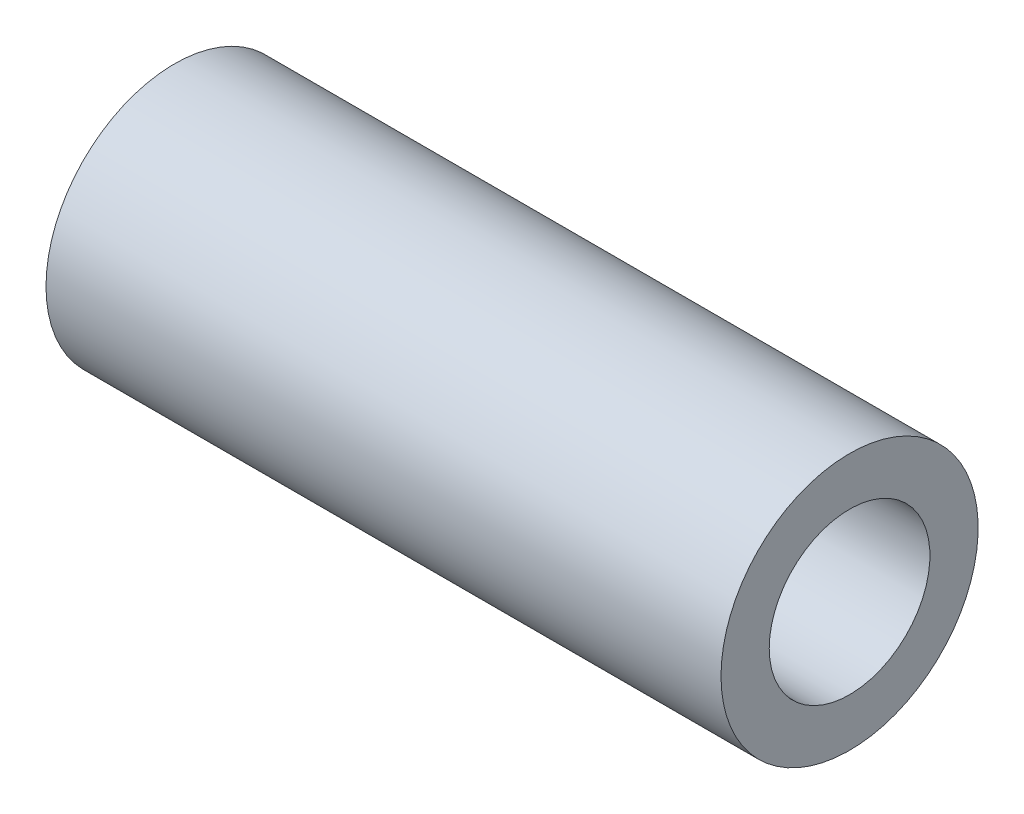
ISO-10303-21;
HEADER;
FILE_DESCRIPTION(('STEP AP214'),'2;1');
FILE_NAME('part.step','',(''),(''),'','','');
FILE_SCHEMA(('AUTOMOTIVE_DESIGN { 1 0 10303 214 1 1 1 1 }'));
ENDSEC;
DATA;
#1=APPLICATION_CONTEXT('core data for automotive mechanical design processes');
#2=APPLICATION_PROTOCOL_DEFINITION('international standard','automotive_design',2000,#1);
#3=PRODUCT_CONTEXT('',#1,'mechanical');
#4=PRODUCT('Part','Part','',(#3));
#5=PRODUCT_RELATED_PRODUCT_CATEGORY('part','',(#4));
#6=PRODUCT_DEFINITION_FORMATION('','',#4);
#7=PRODUCT_DEFINITION_CONTEXT('part definition',#1,'design');
#8=PRODUCT_DEFINITION('design','',#6,#7);
#9=PRODUCT_DEFINITION_SHAPE('','',#8);
#10=(LENGTH_UNIT() NAMED_UNIT(*) SI_UNIT(.MILLI.,.METRE.));
#11=(NAMED_UNIT(*) PLANE_ANGLE_UNIT() SI_UNIT($,.RADIAN.));
#12=(NAMED_UNIT(*) SI_UNIT($,.STERADIAN.) SOLID_ANGLE_UNIT());
#13=UNCERTAINTY_MEASURE_WITH_UNIT(LENGTH_MEASURE(1.E-05),#10,'distance_accuracy_value','');
#14=(GEOMETRIC_REPRESENTATION_CONTEXT(3) GLOBAL_UNCERTAINTY_ASSIGNED_CONTEXT((#13)) GLOBAL_UNIT_ASSIGNED_CONTEXT((#10,
#11,#12)) REPRESENTATION_CONTEXT('',''));
#15=CARTESIAN_POINT('',(0.,0.,0.));
#16=DIRECTION('',(0.,0.,1.));
#17=DIRECTION('',(1.,0.,0.));
#18=AXIS2_PLACEMENT_3D('',#15,#16,#17);
#19=CARTESIAN_POINT('',(10.5,0.,0.));
#20=DIRECTION('',(1.,0.,0.));
#21=DIRECTION('',(0.,0.,-1.));
#22=AXIS2_PLACEMENT_3D('',#19,#20,#21);
#23=PLANE('',#22);
#24=CARTESIAN_POINT('',(10.5,0.,0.));
#25=DIRECTION('',(1.,0.,0.));
#26=DIRECTION('',(0.,0.,-1.));
#27=AXIS2_PLACEMENT_3D('',#24,#25,#26);
#28=CIRCLE('',#27,4.);
#29=CARTESIAN_POINT('',(10.5,0.,4.));
#30=VERTEX_POINT('',#29);
#31=EDGE_CURVE('E10',#30,#30,#28,.T.);
#32=ORIENTED_EDGE('',*,*,#31,.T.);
#33=EDGE_LOOP('',(#32));
#34=FACE_BOUND('',#33,.T.);
#35=CARTESIAN_POINT('',(10.5,0.,0.));
#36=DIRECTION('',(1.,0.,0.));
#37=DIRECTION('',(0.,0.,-1.));
#38=AXIS2_PLACEMENT_3D('',#35,#36,#37);
#39=CIRCLE('',#38,2.5);
#40=CARTESIAN_POINT('',(10.5,0.,2.5));
#41=VERTEX_POINT('',#40);
#42=EDGE_CURVE('E43',#41,#41,#39,.T.);
#43=ORIENTED_EDGE('',*,*,#42,.F.);
#44=EDGE_LOOP('',(#43));
#45=FACE_BOUND('',#44,.T.);
#46=ADVANCED_FACE('F32',(#34,#45),#23,.T.);
#47=CARTESIAN_POINT('',(-10.5,0.,0.));
#48=DIRECTION('',(1.,0.,0.));
#49=DIRECTION('',(0.,0.,-1.));
#50=AXIS2_PLACEMENT_3D('',#47,#48,#49);
#51=PLANE('',#50);
#52=CARTESIAN_POINT('',(-10.5,0.,0.));
#53=DIRECTION('',(1.,0.,0.));
#54=DIRECTION('',(0.,0.,-1.));
#55=AXIS2_PLACEMENT_3D('',#52,#53,#54);
#56=CIRCLE('',#55,4.);
#57=CARTESIAN_POINT('',(-10.5,0.,4.));
#58=VERTEX_POINT('',#57);
#59=EDGE_CURVE('E36',#58,#58,#56,.T.);
#60=ORIENTED_EDGE('',*,*,#59,.F.);
#61=EDGE_LOOP('',(#60));
#62=FACE_BOUND('',#61,.T.);
#63=CARTESIAN_POINT('',(-10.5,0.,0.));
#64=DIRECTION('',(1.,0.,0.));
#65=DIRECTION('',(0.,0.,-1.));
#66=AXIS2_PLACEMENT_3D('',#63,#64,#65);
#67=CIRCLE('',#66,2.5);
#68=CARTESIAN_POINT('',(-10.5,0.,2.5));
#69=VERTEX_POINT('',#68);
#70=EDGE_CURVE('E45',#69,#69,#67,.T.);
#71=ORIENTED_EDGE('',*,*,#70,.T.);
#72=EDGE_LOOP('',(#71));
#73=FACE_BOUND('',#72,.T.);
#74=ADVANCED_FACE('F55',(#62,#73),#51,.F.);
#75=CARTESIAN_POINT('',(10.5,0.,0.));
#76=DIRECTION('',(-1.,0.,0.));
#77=DIRECTION('',(0.,0.,1.));
#78=AXIS2_PLACEMENT_3D('',#75,#76,#77);
#79=CYLINDRICAL_SURFACE('',#78,4.);
#80=CARTESIAN_POINT('',(10.5,0.,4.));
#81=CARTESIAN_POINT('',(10.28125,0.,4.));
#82=CARTESIAN_POINT('',(10.0625,0.,4.));
#83=CARTESIAN_POINT('',(9.625,0.,4.));
#84=CARTESIAN_POINT('',(9.40625,0.,4.));
#85=CARTESIAN_POINT('',(8.96875,0.,4.));
#86=CARTESIAN_POINT('',(8.75,0.,4.));
#87=CARTESIAN_POINT('',(8.3125,0.,4.));
#88=CARTESIAN_POINT('',(8.09375,0.,4.));
#89=CARTESIAN_POINT('',(7.65625,0.,4.));
#90=CARTESIAN_POINT('',(7.4375,0.,4.));
#91=CARTESIAN_POINT('',(7.,0.,4.));
#92=CARTESIAN_POINT('',(6.78125,0.,4.));
#93=CARTESIAN_POINT('',(6.34375,0.,4.));
#94=CARTESIAN_POINT('',(6.125,0.,4.));
#95=CARTESIAN_POINT('',(5.6875,0.,4.));
#96=CARTESIAN_POINT('',(5.46875,0.,4.));
#97=CARTESIAN_POINT('',(5.03125,0.,4.));
#98=CARTESIAN_POINT('',(4.8125,0.,4.));
#99=CARTESIAN_POINT('',(4.375,0.,4.));
#100=CARTESIAN_POINT('',(4.15625,0.,4.));
#101=CARTESIAN_POINT('',(3.71875,0.,4.));
#102=CARTESIAN_POINT('',(3.5,0.,4.));
#103=CARTESIAN_POINT('',(3.0625,0.,4.));
#104=CARTESIAN_POINT('',(2.84375,0.,4.));
#105=CARTESIAN_POINT('',(2.40625,0.,4.));
#106=CARTESIAN_POINT('',(2.1875,0.,4.));
#107=CARTESIAN_POINT('',(1.75,0.,4.));
#108=CARTESIAN_POINT('',(1.53125,0.,4.));
#109=CARTESIAN_POINT('',(1.09375,0.,4.));
#110=CARTESIAN_POINT('',(0.875000000000001,0.,4.));
#111=CARTESIAN_POINT('',(0.4375,0.,4.));
#112=CARTESIAN_POINT('',(0.21875,0.,4.));
#113=CARTESIAN_POINT('',(-0.21875,0.,4.));
#114=CARTESIAN_POINT('',(-0.4375,0.,4.));
#115=CARTESIAN_POINT('',(-0.875000000000001,0.,4.));
#116=CARTESIAN_POINT('',(-1.09375,0.,4.));
#117=CARTESIAN_POINT('',(-1.53125,0.,4.));
#118=CARTESIAN_POINT('',(-1.75,0.,4.));
#119=CARTESIAN_POINT('',(-2.1875,0.,4.));
#120=CARTESIAN_POINT('',(-2.40625,0.,4.));
#121=CARTESIAN_POINT('',(-2.84375,0.,4.));
#122=CARTESIAN_POINT('',(-3.0625,0.,4.));
#123=CARTESIAN_POINT('',(-3.5,0.,4.));
#124=CARTESIAN_POINT('',(-3.71875,0.,4.));
#125=CARTESIAN_POINT('',(-4.15625,0.,4.));
#126=CARTESIAN_POINT('',(-4.375,0.,4.));
#127=CARTESIAN_POINT('',(-4.8125,0.,4.));
#128=CARTESIAN_POINT('',(-5.03125,0.,4.));
#129=CARTESIAN_POINT('',(-5.46875,0.,4.));
#130=CARTESIAN_POINT('',(-5.6875,0.,4.));
#131=CARTESIAN_POINT('',(-6.125,0.,4.));
#132=CARTESIAN_POINT('',(-6.34375,0.,4.));
#133=CARTESIAN_POINT('',(-6.78125,0.,4.));
#134=CARTESIAN_POINT('',(-7.,0.,4.));
#135=CARTESIAN_POINT('',(-7.4375,0.,4.));
#136=CARTESIAN_POINT('',(-7.65625,0.,4.));
#137=CARTESIAN_POINT('',(-8.09375,0.,4.));
#138=CARTESIAN_POINT('',(-8.3125,0.,4.));
#139=CARTESIAN_POINT('',(-8.75,0.,4.));
#140=CARTESIAN_POINT('',(-8.96875,0.,4.));
#141=CARTESIAN_POINT('',(-9.40625,0.,4.));
#142=CARTESIAN_POINT('',(-9.625,0.,4.));
#143=CARTESIAN_POINT('',(-10.0625,0.,4.));
#144=CARTESIAN_POINT('',(-10.28125,0.,4.));
#145=CARTESIAN_POINT('',(-10.5,0.,4.));
#146=B_SPLINE_CURVE_WITH_KNOTS('',3,(#80,#81,#82,#83,#84,#85,#86,#87,#88,#89,#90,#91,#92,#93,
#94,#95,#96,#97,#98,#99,#100,#101,#102,#103,#104,#105,#106,#107,#108,#109,#110,#111,#112,#113,
#114,#115,#116,#117,#118,#119,#120,#121,#122,#123,#124,#125,#126,#127,#128,#129,#130,#131,#132,
#133,#134,#135,#136,#137,#138,#139,#140,#141,#142,#143,#144,#145),.UNSPECIFIED.,.F.,.F.,(4,2,2,
2,2,2,2,2,2,2,2,2,2,2,2,2,2,2,2,2,2,2,2,2,2,2,2,2,2,2,2,2,4),(0.,0.656250000000001,1.3125,
1.96875,2.625,3.28125,3.9375,4.59375,5.25,5.90625,6.5625,7.21875,7.875,8.53125,9.1875,9.84375,
10.5,11.15625,11.8125,12.46875,13.125,13.78125,14.4375,15.09375,15.75,16.40625,17.0625,17.71875,
18.375,19.03125,19.6875,20.34375,21.),.UNSPECIFIED.);
#147=EDGE_CURVE('BSEAM34',#30,#58,#146,.T.);
#148=ORIENTED_EDGE('',*,*,#31,.F.);
#149=ORIENTED_EDGE('',*,*,#59,.T.);
#150=ORIENTED_EDGE('',*,*,#147,.T.);
#151=ORIENTED_EDGE('',*,*,#147,.F.);
#152=EDGE_LOOP('',(#148,#150,#149,#151));
#153=FACE_BOUND('',#152,.T.);
#154=ADVANCED_FACE('F34',(#153),#79,.T.);
#155=CARTESIAN_POINT('',(10.5,0.,0.));
#156=DIRECTION('',(-1.,0.,0.));
#157=DIRECTION('',(0.,0.,1.));
#158=AXIS2_PLACEMENT_3D('',#155,#156,#157);
#159=CYLINDRICAL_SURFACE('',#158,2.5);
#160=CARTESIAN_POINT('',(10.5,0.,2.5));
#161=CARTESIAN_POINT('',(10.28125,0.,2.5));
#162=CARTESIAN_POINT('',(10.0625,0.,2.5));
#163=CARTESIAN_POINT('',(9.625,0.,2.5));
#164=CARTESIAN_POINT('',(9.40625,0.,2.5));
#165=CARTESIAN_POINT('',(8.96875,0.,2.5));
#166=CARTESIAN_POINT('',(8.75,0.,2.5));
#167=CARTESIAN_POINT('',(8.3125,0.,2.5));
#168=CARTESIAN_POINT('',(8.09375,0.,2.5));
#169=CARTESIAN_POINT('',(7.65625,0.,2.5));
#170=CARTESIAN_POINT('',(7.4375,0.,2.5));
#171=CARTESIAN_POINT('',(7.,0.,2.5));
#172=CARTESIAN_POINT('',(6.78125,0.,2.5));
#173=CARTESIAN_POINT('',(6.34375,0.,2.5));
#174=CARTESIAN_POINT('',(6.125,0.,2.5));
#175=CARTESIAN_POINT('',(5.6875,0.,2.5));
#176=CARTESIAN_POINT('',(5.46875,0.,2.5));
#177=CARTESIAN_POINT('',(5.03125,0.,2.5));
#178=CARTESIAN_POINT('',(4.8125,0.,2.5));
#179=CARTESIAN_POINT('',(4.375,0.,2.5));
#180=CARTESIAN_POINT('',(4.15625,0.,2.5));
#181=CARTESIAN_POINT('',(3.71875,0.,2.5));
#182=CARTESIAN_POINT('',(3.5,0.,2.5));
#183=CARTESIAN_POINT('',(3.0625,0.,2.5));
#184=CARTESIAN_POINT('',(2.84375,0.,2.5));
#185=CARTESIAN_POINT('',(2.40625,0.,2.5));
#186=CARTESIAN_POINT('',(2.1875,0.,2.5));
#187=CARTESIAN_POINT('',(1.75,0.,2.5));
#188=CARTESIAN_POINT('',(1.53125,0.,2.5));
#189=CARTESIAN_POINT('',(1.09375,0.,2.5));
#190=CARTESIAN_POINT('',(0.875000000000001,0.,2.5));
#191=CARTESIAN_POINT('',(0.4375,0.,2.5));
#192=CARTESIAN_POINT('',(0.21875,0.,2.5));
#193=CARTESIAN_POINT('',(-0.21875,0.,2.5));
#194=CARTESIAN_POINT('',(-0.4375,0.,2.5));
#195=CARTESIAN_POINT('',(-0.875000000000001,0.,2.5));
#196=CARTESIAN_POINT('',(-1.09375,0.,2.5));
#197=CARTESIAN_POINT('',(-1.53125,0.,2.5));
#198=CARTESIAN_POINT('',(-1.75,0.,2.5));
#199=CARTESIAN_POINT('',(-2.1875,0.,2.5));
#200=CARTESIAN_POINT('',(-2.40625,0.,2.5));
#201=CARTESIAN_POINT('',(-2.84375,0.,2.5));
#202=CARTESIAN_POINT('',(-3.0625,0.,2.5));
#203=CARTESIAN_POINT('',(-3.5,0.,2.5));
#204=CARTESIAN_POINT('',(-3.71875,0.,2.5));
#205=CARTESIAN_POINT('',(-4.15625,0.,2.5));
#206=CARTESIAN_POINT('',(-4.375,0.,2.5));
#207=CARTESIAN_POINT('',(-4.8125,0.,2.5));
#208=CARTESIAN_POINT('',(-5.03125,0.,2.5));
#209=CARTESIAN_POINT('',(-5.46875,0.,2.5));
#210=CARTESIAN_POINT('',(-5.6875,0.,2.5));
#211=CARTESIAN_POINT('',(-6.125,0.,2.5));
#212=CARTESIAN_POINT('',(-6.34375,0.,2.5));
#213=CARTESIAN_POINT('',(-6.78125,0.,2.5));
#214=CARTESIAN_POINT('',(-7.,0.,2.5));
#215=CARTESIAN_POINT('',(-7.4375,0.,2.5));
#216=CARTESIAN_POINT('',(-7.65625,0.,2.5));
#217=CARTESIAN_POINT('',(-8.09375,0.,2.5));
#218=CARTESIAN_POINT('',(-8.3125,0.,2.5));
#219=CARTESIAN_POINT('',(-8.75,0.,2.5));
#220=CARTESIAN_POINT('',(-8.96875,0.,2.5));
#221=CARTESIAN_POINT('',(-9.40625,0.,2.5));
#222=CARTESIAN_POINT('',(-9.625,0.,2.5));
#223=CARTESIAN_POINT('',(-10.0625,0.,2.5));
#224=CARTESIAN_POINT('',(-10.28125,0.,2.5));
#225=CARTESIAN_POINT('',(-10.5,0.,2.5));
#226=B_SPLINE_CURVE_WITH_KNOTS('',3,(#160,#161,#162,#163,#164,#165,#166,#167,#168,#169,#170,
#171,#172,#173,#174,#175,#176,#177,#178,#179,#180,#181,#182,#183,#184,#185,#186,#187,#188,#189,
#190,#191,#192,#193,#194,#195,#196,#197,#198,#199,#200,#201,#202,#203,#204,#205,#206,#207,#208,
#209,#210,#211,#212,#213,#214,#215,#216,#217,#218,#219,#220,#221,#222,#223,#224,#225),
.UNSPECIFIED.,.F.,.F.,(4,2,2,2,2,2,2,2,2,2,2,2,2,2,2,2,2,2,2,2,2,2,2,2,2,2,2,2,2,2,2,2,4),(0.,
0.656250000000001,1.3125,1.96875,2.625,3.28125,3.9375,4.59375,5.25,5.90625,6.5625,7.21875,7.875,
8.53125,9.1875,9.84375,10.5,11.15625,11.8125,12.46875,13.125,13.78125,14.4375,15.09375,15.75,
16.40625,17.0625,17.71875,18.375,19.03125,19.6875,20.34375,21.),.UNSPECIFIED.);
#227=EDGE_CURVE('BSEAM51',#41,#69,#226,.T.);
#228=ORIENTED_EDGE('',*,*,#42,.T.);
#229=ORIENTED_EDGE('',*,*,#70,.F.);
#230=ORIENTED_EDGE('',*,*,#227,.T.);
#231=ORIENTED_EDGE('',*,*,#227,.F.);
#232=EDGE_LOOP('',(#228,#230,#229,#231));
#233=FACE_BOUND('',#232,.T.);
#234=ADVANCED_FACE('F51',(#233),#159,.F.);
#235=CLOSED_SHELL('',(#46,#74,#154,#234));
#236=MANIFOLD_SOLID_BREP('B2',#235);
#237=ADVANCED_BREP_SHAPE_REPRESENTATION('',(#18,#236),#14);
#238=SHAPE_DEFINITION_REPRESENTATION(#9,#237);
ENDSEC;
END-ISO-10303-21;
